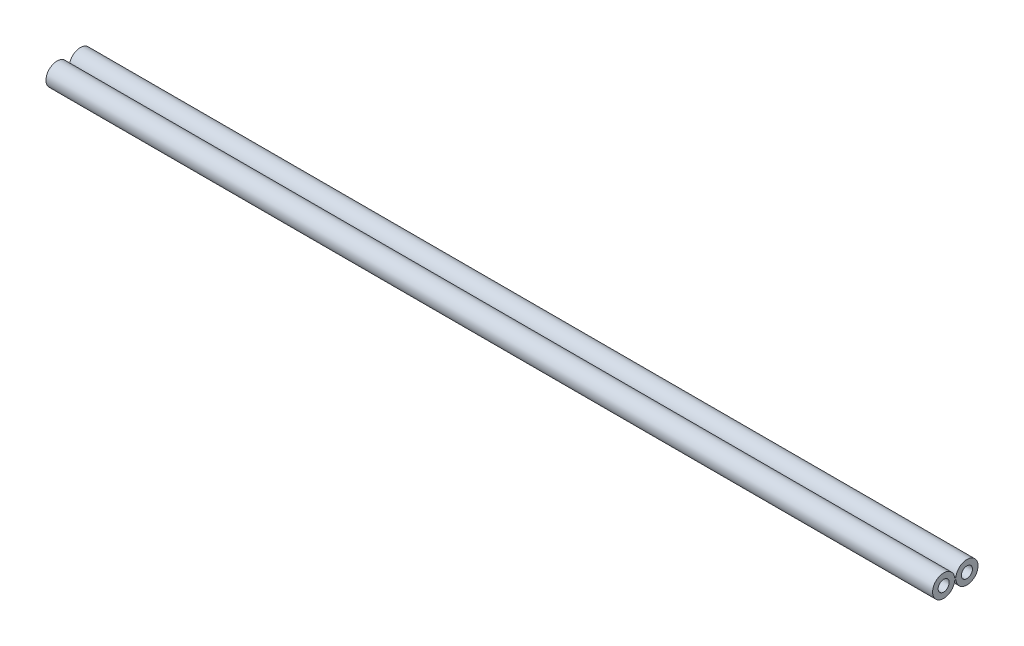
ISO-10303-21;
HEADER;
FILE_DESCRIPTION(('STEP AP214'),'2;1');
FILE_NAME('part.step','',(''),(''),'','','');
FILE_SCHEMA(('AUTOMOTIVE_DESIGN { 1 0 10303 214 1 1 1 1 }'));
ENDSEC;
DATA;
#1=APPLICATION_CONTEXT('core data for automotive mechanical design processes');
#2=APPLICATION_PROTOCOL_DEFINITION('international standard','automotive_design',2000,#1);
#3=PRODUCT_CONTEXT('',#1,'mechanical');
#4=PRODUCT('Part','Part','',(#3));
#5=PRODUCT_RELATED_PRODUCT_CATEGORY('part','',(#4));
#6=PRODUCT_DEFINITION_FORMATION('','',#4);
#7=PRODUCT_DEFINITION_CONTEXT('part definition',#1,'design');
#8=PRODUCT_DEFINITION('design','',#6,#7);
#9=PRODUCT_DEFINITION_SHAPE('','',#8);
#10=(LENGTH_UNIT() NAMED_UNIT(*) SI_UNIT(.MILLI.,.METRE.));
#11=(NAMED_UNIT(*) PLANE_ANGLE_UNIT() SI_UNIT($,.RADIAN.));
#12=(NAMED_UNIT(*) SI_UNIT($,.STERADIAN.) SOLID_ANGLE_UNIT());
#13=UNCERTAINTY_MEASURE_WITH_UNIT(LENGTH_MEASURE(1.E-05),#10,'distance_accuracy_value','');
#14=(GEOMETRIC_REPRESENTATION_CONTEXT(3) GLOBAL_UNCERTAINTY_ASSIGNED_CONTEXT((#13)) GLOBAL_UNIT_ASSIGNED_CONTEXT((#10,
#11,#12)) REPRESENTATION_CONTEXT('',''));
#15=CARTESIAN_POINT('',(0.,0.,0.));
#16=DIRECTION('',(0.,0.,1.));
#17=DIRECTION('',(1.,0.,0.));
#18=AXIS2_PLACEMENT_3D('',#15,#16,#17);
#19=CARTESIAN_POINT('',(127.,0.,-3.33375));
#20=DIRECTION('',(-1.,0.,0.));
#21=DIRECTION('',(0.,0.,1.));
#22=AXIS2_PLACEMENT_3D('',#19,#20,#21);
#23=CYLINDRICAL_SURFACE('',#22,3.175);
#24=DIRECTION('',(-1.,0.,0.));
#25=VECTOR('',#24,1.);
#26=CARTESIAN_POINT('',(127.,0.324786885245856,-0.175405737704919));
#27=LINE('',#26,#25);
#28=CARTESIAN_POINT('',(127.,0.324786885245858,-0.175405737704914));
#29=VERTEX_POINT('',#28);
#30=CARTESIAN_POINT('',(-127.,0.324786885245858,-0.175405737704914));
#31=VERTEX_POINT('',#30);
#32=EDGE_CURVE('E51',#29,#31,#27,.T.);
#33=ORIENTED_EDGE('',*,*,#32,.F.);
#34=CARTESIAN_POINT('',(127.,0.,-3.33375));
#35=DIRECTION('',(1.,0.,0.));
#36=DIRECTION('',(0.,0.,-1.));
#37=AXIS2_PLACEMENT_3D('',#34,#35,#36);
#38=CIRCLE('',#37,3.175);
#39=CARTESIAN_POINT('',(127.,-0.324786885245909,-0.175405737704919));
#40=VERTEX_POINT('',#39);
#41=EDGE_CURVE('E11',#40,#29,#38,.T.);
#42=ORIENTED_EDGE('',*,*,#41,.F.);
#43=DIRECTION('',(-1.,0.,0.));
#44=VECTOR('',#43,1.);
#45=CARTESIAN_POINT('',(127.,-0.324786885245949,-0.175405737704919));
#46=LINE('',#45,#44);
#47=CARTESIAN_POINT('',(-127.,-0.324786885245949,-0.175405737704919));
#48=VERTEX_POINT('',#47);
#49=EDGE_CURVE('E135',#40,#48,#46,.T.);
#50=ORIENTED_EDGE('',*,*,#49,.T.);
#51=CARTESIAN_POINT('',(-127.,0.,-3.33375));
#52=DIRECTION('',(1.,0.,0.));
#53=DIRECTION('',(0.,0.,-1.));
#54=AXIS2_PLACEMENT_3D('',#51,#52,#53);
#55=CIRCLE('',#54,3.175);
#56=EDGE_CURVE('E37',#48,#31,#55,.T.);
#57=ORIENTED_EDGE('',*,*,#56,.T.);
#58=EDGE_LOOP('',(#33,#42,#50,#57));
#59=FACE_BOUND('',#58,.T.);
#60=ADVANCED_FACE('F34',(#59),#23,.T.);
#61=CARTESIAN_POINT('',(127.,0.,-3.33375));
#62=DIRECTION('',(1.,0.,0.));
#63=DIRECTION('',(0.,0.,-1.));
#64=AXIS2_PLACEMENT_3D('',#61,#62,#63);
#65=PLANE('',#64);
#66=CARTESIAN_POINT('',(127.,-0.33466216216221,-0.0793749999999996));
#67=DIRECTION('',(-1.,0.,0.));
#68=DIRECTION('',(0.,0.,1.));
#69=AXIS2_PLACEMENT_3D('',#66,#67,#68);
#70=CIRCLE('',#69,0.0965371621621634);
#71=CARTESIAN_POINT('',(127.,-0.238125000000047,-0.0793749999999996));
#72=VERTEX_POINT('',#71);
#73=EDGE_CURVE('E181',#72,#40,#70,.T.);
#74=ORIENTED_EDGE('',*,*,#73,.T.);
#75=ORIENTED_EDGE('',*,*,#41,.T.);
#76=CARTESIAN_POINT('',(127.,0.334662162162116,-0.0793749999999996));
#77=DIRECTION('',(-1.,0.,0.));
#78=DIRECTION('',(0.,0.,-1.));
#79=AXIS2_PLACEMENT_3D('',#76,#77,#78);
#80=CIRCLE('',#79,0.0965371621621632);
#81=CARTESIAN_POINT('',(127.,0.238124999999953,-0.0793749999999996));
#82=VERTEX_POINT('',#81);
#83=EDGE_CURVE('E146',#29,#82,#80,.T.);
#84=ORIENTED_EDGE('',*,*,#83,.T.);
#85=DIRECTION('',(0.,0.,1.));
#86=VECTOR('',#85,1.);
#87=CARTESIAN_POINT('',(127.,0.238124999999953,0.0793749999999996));
#88=LINE('',#87,#86);
#89=CARTESIAN_POINT('',(127.,0.238124999999953,0.0793749999999996));
#90=VERTEX_POINT('',#89);
#91=EDGE_CURVE('E112',#82,#90,#88,.T.);
#92=ORIENTED_EDGE('',*,*,#91,.T.);
#93=CARTESIAN_POINT('',(127.,0.334662162162116,0.0793749999999996));
#94=DIRECTION('',(-1.,0.,0.));
#95=DIRECTION('',(0.,0.,1.));
#96=AXIS2_PLACEMENT_3D('',#93,#94,#95);
#97=CIRCLE('',#96,0.0965371621621627);
#98=CARTESIAN_POINT('',(127.,0.324786885245901,0.175405737704918));
#99=VERTEX_POINT('',#98);
#100=EDGE_CURVE('E108',#90,#99,#97,.T.);
#101=ORIENTED_EDGE('',*,*,#100,.T.);
#102=CARTESIAN_POINT('',(127.,0.,3.33375));
#103=DIRECTION('',(1.,0.,0.));
#104=DIRECTION('',(0.,0.,-1.));
#105=AXIS2_PLACEMENT_3D('',#102,#103,#104);
#106=CIRCLE('',#105,3.175);
#107=CARTESIAN_POINT('',(127.,-0.324786885245947,0.175405737704923));
#108=VERTEX_POINT('',#107);
#109=EDGE_CURVE('E94',#99,#108,#106,.T.);
#110=ORIENTED_EDGE('',*,*,#109,.T.);
#111=CARTESIAN_POINT('',(127.,-0.334662162162209,0.0793749999999996));
#112=DIRECTION('',(-1.,0.,0.));
#113=DIRECTION('',(0.,0.,-1.));
#114=AXIS2_PLACEMENT_3D('',#111,#112,#113);
#115=CIRCLE('',#114,0.0965371621621625);
#116=CARTESIAN_POINT('',(127.,-0.238125000000047,0.0793749999999996));
#117=VERTEX_POINT('',#116);
#118=EDGE_CURVE('E116',#108,#117,#115,.T.);
#119=ORIENTED_EDGE('',*,*,#118,.T.);
#120=DIRECTION('',(0.,0.,-1.));
#121=VECTOR('',#120,1.);
#122=CARTESIAN_POINT('',(127.,-0.238125000000047,0.0793749999999996));
#123=LINE('',#122,#121);
#124=EDGE_CURVE('E172',#117,#72,#123,.T.);
#125=ORIENTED_EDGE('',*,*,#124,.T.);
#126=EDGE_LOOP('',(#74,#75,#84,#92,#101,#110,#119,#125));
#127=FACE_BOUND('',#126,.T.);
#128=CARTESIAN_POINT('',(127.,0.,-3.33375));
#129=DIRECTION('',(1.,0.,0.));
#130=DIRECTION('',(0.,0.,-1.));
#131=AXIS2_PLACEMENT_3D('',#128,#129,#130);
#132=CIRCLE('',#131,1.5875);
#133=CARTESIAN_POINT('',(127.,0.,-4.92125));
#134=VERTEX_POINT('',#133);
#135=EDGE_CURVE('E125',#134,#134,#132,.T.);
#136=ORIENTED_EDGE('',*,*,#135,.F.);
#137=EDGE_LOOP('',(#136));
#138=FACE_BOUND('',#137,.T.);
#139=CARTESIAN_POINT('',(127.,0.,3.33375));
#140=DIRECTION('',(1.,0.,0.));
#141=DIRECTION('',(0.,0.,-1.));
#142=AXIS2_PLACEMENT_3D('',#139,#140,#141);
#143=CIRCLE('',#142,1.5875);
#144=CARTESIAN_POINT('',(127.,0.,1.74625));
#145=VERTEX_POINT('',#144);
#146=EDGE_CURVE('E185',#145,#145,#143,.T.);
#147=ORIENTED_EDGE('',*,*,#146,.F.);
#148=EDGE_LOOP('',(#147));
#149=FACE_BOUND('',#148,.T.);
#150=ADVANCED_FACE('F109',(#127,#138,#149),#65,.T.);
#151=CARTESIAN_POINT('',(-127.,0.,-3.33375));
#152=DIRECTION('',(1.,0.,0.));
#153=DIRECTION('',(0.,0.,-1.));
#154=AXIS2_PLACEMENT_3D('',#151,#152,#153);
#155=PLANE('',#154);
#156=ORIENTED_EDGE('',*,*,#56,.F.);
#157=CARTESIAN_POINT('',(-127.,-0.33466216216221,-0.0793749999999996));
#158=DIRECTION('',(-1.,0.,0.));
#159=DIRECTION('',(0.,0.,1.));
#160=AXIS2_PLACEMENT_3D('',#157,#158,#159);
#161=CIRCLE('',#160,0.0965371621621634);
#162=CARTESIAN_POINT('',(-127.,-0.238125000000047,-0.0793749999999996));
#163=VERTEX_POINT('',#162);
#164=EDGE_CURVE('E152',#163,#48,#161,.T.);
#165=ORIENTED_EDGE('',*,*,#164,.F.);
#166=DIRECTION('',(0.,0.,-1.));
#167=VECTOR('',#166,1.);
#168=CARTESIAN_POINT('',(-127.,-0.238125000000047,0.0793749999999996));
#169=LINE('',#168,#167);
#170=CARTESIAN_POINT('',(-127.,-0.238125000000047,0.0793749999999996));
#171=VERTEX_POINT('',#170);
#172=EDGE_CURVE('E155',#171,#163,#169,.T.);
#173=ORIENTED_EDGE('',*,*,#172,.F.);
#174=CARTESIAN_POINT('',(-127.,-0.334662162162209,0.0793749999999996));
#175=DIRECTION('',(-1.,0.,0.));
#176=DIRECTION('',(0.,0.,-1.));
#177=AXIS2_PLACEMENT_3D('',#174,#175,#176);
#178=CIRCLE('',#177,0.0965371621621625);
#179=CARTESIAN_POINT('',(-127.,-0.324786885245949,0.175405737704918));
#180=VERTEX_POINT('',#179);
#181=EDGE_CURVE('E175',#180,#171,#178,.T.);
#182=ORIENTED_EDGE('',*,*,#181,.F.);
#183=CARTESIAN_POINT('',(-127.,0.,3.33375));
#184=DIRECTION('',(1.,0.,0.));
#185=DIRECTION('',(0.,0.,-1.));
#186=AXIS2_PLACEMENT_3D('',#183,#184,#185);
#187=CIRCLE('',#186,3.175);
#188=CARTESIAN_POINT('',(-127.,0.324786885245901,0.175405737704918));
#189=VERTEX_POINT('',#188);
#190=EDGE_CURVE('E105',#189,#180,#187,.T.);
#191=ORIENTED_EDGE('',*,*,#190,.F.);
#192=CARTESIAN_POINT('',(-127.,0.334662162162116,0.0793749999999996));
#193=DIRECTION('',(-1.,0.,0.));
#194=DIRECTION('',(0.,0.,1.));
#195=AXIS2_PLACEMENT_3D('',#192,#193,#194);
#196=CIRCLE('',#195,0.0965371621621627);
#197=CARTESIAN_POINT('',(-127.,0.238124999999953,0.0793749999999996));
#198=VERTEX_POINT('',#197);
#199=EDGE_CURVE('E104',#198,#189,#196,.T.);
#200=ORIENTED_EDGE('',*,*,#199,.F.);
#201=DIRECTION('',(0.,0.,1.));
#202=VECTOR('',#201,1.);
#203=CARTESIAN_POINT('',(-127.,0.238124999999953,0.0793749999999996));
#204=LINE('',#203,#202);
#205=CARTESIAN_POINT('',(-127.,0.238124999999953,-0.0793749999999996));
#206=VERTEX_POINT('',#205);
#207=EDGE_CURVE('E117',#206,#198,#204,.T.);
#208=ORIENTED_EDGE('',*,*,#207,.F.);
#209=CARTESIAN_POINT('',(-127.,0.334662162162116,-0.0793749999999996));
#210=DIRECTION('',(-1.,0.,0.));
#211=DIRECTION('',(0.,0.,-1.));
#212=AXIS2_PLACEMENT_3D('',#209,#210,#211);
#213=CIRCLE('',#212,0.0965371621621632);
#214=EDGE_CURVE('E144',#31,#206,#213,.T.);
#215=ORIENTED_EDGE('',*,*,#214,.F.);
#216=EDGE_LOOP('',(#156,#165,#173,#182,#191,#200,#208,#215));
#217=FACE_BOUND('',#216,.T.);
#218=CARTESIAN_POINT('',(-127.,0.,-3.33375));
#219=DIRECTION('',(1.,0.,0.));
#220=DIRECTION('',(0.,0.,-1.));
#221=AXIS2_PLACEMENT_3D('',#218,#219,#220);
#222=CIRCLE('',#221,1.5875);
#223=CARTESIAN_POINT('',(-127.,0.,-4.92125));
#224=VERTEX_POINT('',#223);
#225=EDGE_CURVE('E122',#224,#224,#222,.T.);
#226=ORIENTED_EDGE('',*,*,#225,.T.);
#227=EDGE_LOOP('',(#226));
#228=FACE_BOUND('',#227,.T.);
#229=CARTESIAN_POINT('',(-127.,0.,3.33375));
#230=DIRECTION('',(1.,0.,0.));
#231=DIRECTION('',(0.,0.,-1.));
#232=AXIS2_PLACEMENT_3D('',#229,#230,#231);
#233=CIRCLE('',#232,1.5875);
#234=CARTESIAN_POINT('',(-127.,0.,1.74625));
#235=VERTEX_POINT('',#234);
#236=EDGE_CURVE('E187',#235,#235,#233,.T.);
#237=ORIENTED_EDGE('',*,*,#236,.T.);
#238=EDGE_LOOP('',(#237));
#239=FACE_BOUND('',#238,.T.);
#240=ADVANCED_FACE('F150',(#217,#228,#239),#155,.F.);
#241=CARTESIAN_POINT('',(127.,0.,-3.33375));
#242=DIRECTION('',(-1.,0.,0.));
#243=DIRECTION('',(0.,0.,1.));
#244=AXIS2_PLACEMENT_3D('',#241,#242,#243);
#245=CYLINDRICAL_SURFACE('',#244,1.5875);
#246=ORIENTED_EDGE('',*,*,#135,.T.);
#247=EDGE_LOOP('',(#246));
#248=FACE_BOUND('',#247,.T.);
#249=ORIENTED_EDGE('',*,*,#225,.F.);
#250=EDGE_LOOP('',(#249));
#251=FACE_BOUND('',#250,.T.);
#252=ADVANCED_FACE('F202',(#248,#251),#245,.F.);
#253=CARTESIAN_POINT('',(127.,0.334662162162116,0.0793749999999996));
#254=DIRECTION('',(-1.,0.,0.));
#255=DIRECTION('',(0.,0.,1.));
#256=AXIS2_PLACEMENT_3D('',#253,#254,#255);
#257=CYLINDRICAL_SURFACE('',#256,0.0965371621621627);
#258=ORIENTED_EDGE('',*,*,#199,.T.);
#259=DIRECTION('',(-1.,0.,0.));
#260=VECTOR('',#259,1.);
#261=CARTESIAN_POINT('',(127.,0.324786885245856,0.175405737704918));
#262=LINE('',#261,#260);
#263=EDGE_CURVE('E98',#99,#189,#262,.T.);
#264=ORIENTED_EDGE('',*,*,#263,.F.);
#265=ORIENTED_EDGE('',*,*,#100,.F.);
#266=DIRECTION('',(-1.,0.,0.));
#267=VECTOR('',#266,1.);
#268=CARTESIAN_POINT('',(127.,0.238124999999953,0.0793749999999996));
#269=LINE('',#268,#267);
#270=EDGE_CURVE('E159',#90,#198,#269,.T.);
#271=ORIENTED_EDGE('',*,*,#270,.T.);
#272=EDGE_LOOP('',(#258,#264,#265,#271));
#273=FACE_BOUND('',#272,.T.);
#274=ADVANCED_FACE('F120',(#273),#257,.F.);
#275=CARTESIAN_POINT('',(127.,-0.334662162162209,0.0793749999999996));
#276=DIRECTION('',(-1.,0.,0.));
#277=DIRECTION('',(0.,0.,1.));
#278=AXIS2_PLACEMENT_3D('',#275,#276,#277);
#279=CYLINDRICAL_SURFACE('',#278,0.0965371621621625);
#280=ORIENTED_EDGE('',*,*,#181,.T.);
#281=DIRECTION('',(-1.,0.,0.));
#282=VECTOR('',#281,1.);
#283=CARTESIAN_POINT('',(127.,-0.238125000000047,0.0793749999999996));
#284=LINE('',#283,#282);
#285=EDGE_CURVE('E127',#117,#171,#284,.T.);
#286=ORIENTED_EDGE('',*,*,#285,.F.);
#287=ORIENTED_EDGE('',*,*,#118,.F.);
#288=DIRECTION('',(-1.,0.,0.));
#289=VECTOR('',#288,1.);
#290=CARTESIAN_POINT('',(127.,-0.324786885245949,0.175405737704918));
#291=LINE('',#290,#289);
#292=EDGE_CURVE('E101',#108,#180,#291,.T.);
#293=ORIENTED_EDGE('',*,*,#292,.T.);
#294=EDGE_LOOP('',(#280,#286,#287,#293));
#295=FACE_BOUND('',#294,.T.);
#296=ADVANCED_FACE('F208',(#295),#279,.F.);
#297=CARTESIAN_POINT('',(127.,-0.238125000000047,0.0793749999999996));
#298=DIRECTION('',(0.,1.,0.));
#299=DIRECTION('',(0.,0.,1.));
#300=AXIS2_PLACEMENT_3D('',#297,#298,#299);
#301=PLANE('',#300);
#302=ORIENTED_EDGE('',*,*,#172,.T.);
#303=DIRECTION('',(-1.,0.,0.));
#304=VECTOR('',#303,1.);
#305=CARTESIAN_POINT('',(127.,-0.238125000000047,-0.0793749999999996));
#306=LINE('',#305,#304);
#307=EDGE_CURVE('E163',#72,#163,#306,.T.);
#308=ORIENTED_EDGE('',*,*,#307,.F.);
#309=ORIENTED_EDGE('',*,*,#124,.F.);
#310=ORIENTED_EDGE('',*,*,#285,.T.);
#311=EDGE_LOOP('',(#302,#308,#309,#310));
#312=FACE_BOUND('',#311,.T.);
#313=ADVANCED_FACE('F170',(#312),#301,.F.);
#314=CARTESIAN_POINT('',(127.,-0.33466216216221,-0.0793749999999996));
#315=DIRECTION('',(-1.,0.,0.));
#316=DIRECTION('',(0.,0.,1.));
#317=AXIS2_PLACEMENT_3D('',#314,#315,#316);
#318=CYLINDRICAL_SURFACE('',#317,0.0965371621621634);
#319=ORIENTED_EDGE('',*,*,#164,.T.);
#320=ORIENTED_EDGE('',*,*,#49,.F.);
#321=ORIENTED_EDGE('',*,*,#73,.F.);
#322=ORIENTED_EDGE('',*,*,#307,.T.);
#323=EDGE_LOOP('',(#319,#320,#321,#322));
#324=FACE_BOUND('',#323,.T.);
#325=ADVANCED_FACE('F213',(#324),#318,.F.);
#326=CARTESIAN_POINT('',(127.,0.334662162162116,-0.0793749999999996));
#327=DIRECTION('',(-1.,0.,0.));
#328=DIRECTION('',(0.,0.,1.));
#329=AXIS2_PLACEMENT_3D('',#326,#327,#328);
#330=CYLINDRICAL_SURFACE('',#329,0.0965371621621632);
#331=ORIENTED_EDGE('',*,*,#214,.T.);
#332=DIRECTION('',(-1.,0.,0.));
#333=VECTOR('',#332,1.);
#334=CARTESIAN_POINT('',(127.,0.238124999999953,-0.0793749999999996));
#335=LINE('',#334,#333);
#336=EDGE_CURVE('E147',#82,#206,#335,.T.);
#337=ORIENTED_EDGE('',*,*,#336,.F.);
#338=ORIENTED_EDGE('',*,*,#83,.F.);
#339=ORIENTED_EDGE('',*,*,#32,.T.);
#340=EDGE_LOOP('',(#331,#337,#338,#339));
#341=FACE_BOUND('',#340,.T.);
#342=ADVANCED_FACE('F142',(#341),#330,.F.);
#343=CARTESIAN_POINT('',(127.,0.238124999999953,0.0793749999999996));
#344=DIRECTION('',(0.,-1.,0.));
#345=DIRECTION('',(0.,0.,-1.));
#346=AXIS2_PLACEMENT_3D('',#343,#344,#345);
#347=PLANE('',#346);
#348=ORIENTED_EDGE('',*,*,#207,.T.);
#349=ORIENTED_EDGE('',*,*,#270,.F.);
#350=ORIENTED_EDGE('',*,*,#91,.F.);
#351=ORIENTED_EDGE('',*,*,#336,.T.);
#352=EDGE_LOOP('',(#348,#349,#350,#351));
#353=FACE_BOUND('',#352,.T.);
#354=ADVANCED_FACE('F219',(#353),#347,.F.);
#355=CARTESIAN_POINT('',(127.,0.,3.33375));
#356=DIRECTION('',(-1.,0.,0.));
#357=DIRECTION('',(0.,0.,1.));
#358=AXIS2_PLACEMENT_3D('',#355,#356,#357);
#359=CYLINDRICAL_SURFACE('',#358,3.175);
#360=ORIENTED_EDGE('',*,*,#109,.F.);
#361=ORIENTED_EDGE('',*,*,#263,.T.);
#362=ORIENTED_EDGE('',*,*,#190,.T.);
#363=ORIENTED_EDGE('',*,*,#292,.F.);
#364=EDGE_LOOP('',(#360,#361,#362,#363));
#365=FACE_BOUND('',#364,.T.);
#366=ADVANCED_FACE('F96',(#365),#359,.T.);
#367=CARTESIAN_POINT('',(127.,0.,3.33375));
#368=DIRECTION('',(-1.,0.,0.));
#369=DIRECTION('',(0.,0.,1.));
#370=AXIS2_PLACEMENT_3D('',#367,#368,#369);
#371=CYLINDRICAL_SURFACE('',#370,1.5875);
#372=ORIENTED_EDGE('',*,*,#146,.T.);
#373=EDGE_LOOP('',(#372));
#374=FACE_BOUND('',#373,.T.);
#375=ORIENTED_EDGE('',*,*,#236,.F.);
#376=EDGE_LOOP('',(#375));
#377=FACE_BOUND('',#376,.T.);
#378=ADVANCED_FACE('F193',(#374,#377),#371,.F.);
#379=CLOSED_SHELL('',(#60,#150,#240,#252,#274,#296,#313,#325,#342,#354,#366,#378));
#380=MANIFOLD_SOLID_BREP('B2',#379);
#381=ADVANCED_BREP_SHAPE_REPRESENTATION('',(#18,#380),#14);
#382=SHAPE_DEFINITION_REPRESENTATION(#9,#381);
ENDSEC;
END-ISO-10303-21;
